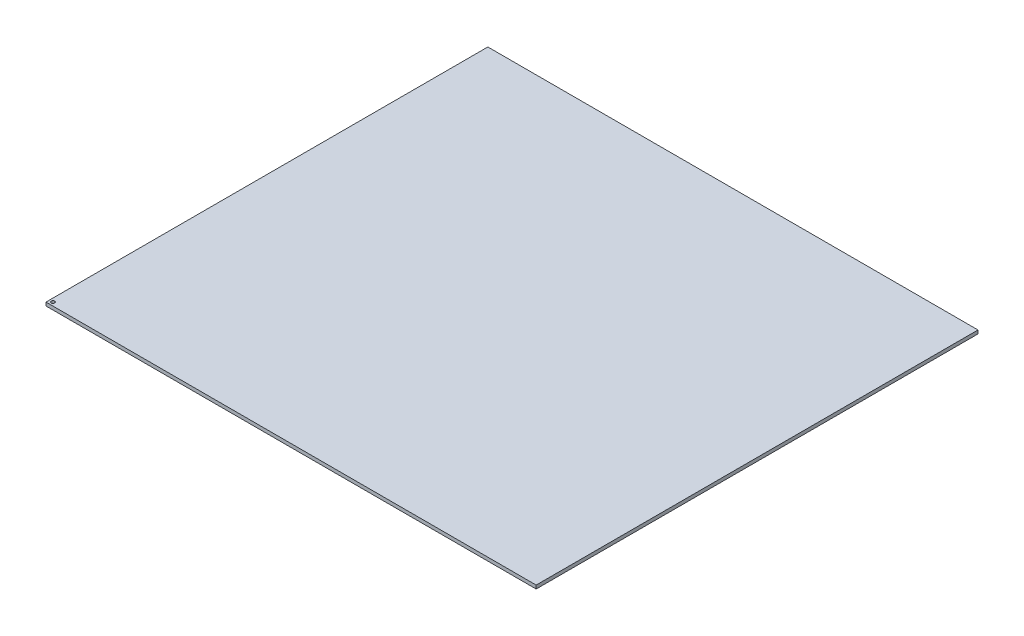
ISO-10303-21;
HEADER;
FILE_DESCRIPTION(('STEP AP214'),'2;1');
FILE_NAME('part.step','',(''),(''),'','','');
FILE_SCHEMA(('AUTOMOTIVE_DESIGN { 1 0 10303 214 1 1 1 1 }'));
ENDSEC;
DATA;
#1=APPLICATION_CONTEXT('core data for automotive mechanical design processes');
#2=APPLICATION_PROTOCOL_DEFINITION('international standard','automotive_design',2000,#1);
#3=PRODUCT_CONTEXT('',#1,'mechanical');
#4=PRODUCT('Part','Part','',(#3));
#5=PRODUCT_RELATED_PRODUCT_CATEGORY('part','',(#4));
#6=PRODUCT_DEFINITION_FORMATION('','',#4);
#7=PRODUCT_DEFINITION_CONTEXT('part definition',#1,'design');
#8=PRODUCT_DEFINITION('design','',#6,#7);
#9=PRODUCT_DEFINITION_SHAPE('','',#8);
#10=(LENGTH_UNIT() NAMED_UNIT(*) SI_UNIT(.MILLI.,.METRE.));
#11=(NAMED_UNIT(*) PLANE_ANGLE_UNIT() SI_UNIT($,.RADIAN.));
#12=(NAMED_UNIT(*) SI_UNIT($,.STERADIAN.) SOLID_ANGLE_UNIT());
#13=UNCERTAINTY_MEASURE_WITH_UNIT(LENGTH_MEASURE(1.E-05),#10,'distance_accuracy_value','');
#14=(GEOMETRIC_REPRESENTATION_CONTEXT(3) GLOBAL_UNCERTAINTY_ASSIGNED_CONTEXT((#13)) GLOBAL_UNIT_ASSIGNED_CONTEXT((#10,
#11,#12)) REPRESENTATION_CONTEXT('',''));
#15=CARTESIAN_POINT('',(0.,0.,0.));
#16=DIRECTION('',(0.,0.,1.));
#17=DIRECTION('',(1.,0.,0.));
#18=AXIS2_PLACEMENT_3D('',#15,#16,#17);
#19=CARTESIAN_POINT('',(450.85,3.175,406.4));
#20=DIRECTION('',(-1.,0.,0.));
#21=DIRECTION('',(0.,0.,1.));
#22=AXIS2_PLACEMENT_3D('',#19,#20,#21);
#23=PLANE('',#22);
#24=DIRECTION('',(0.,0.,-1.));
#25=VECTOR('',#24,1.);
#26=CARTESIAN_POINT('',(450.85,-3.175,406.4));
#27=LINE('',#26,#25);
#28=CARTESIAN_POINT('',(450.85,-3.175,406.4));
#29=VERTEX_POINT('',#28);
#30=CARTESIAN_POINT('',(450.85,-3.175,-406.4));
#31=VERTEX_POINT('',#30);
#32=EDGE_CURVE('E97',#29,#31,#27,.T.);
#33=ORIENTED_EDGE('',*,*,#32,.T.);
#34=DIRECTION('',(0.,-1.,0.));
#35=VECTOR('',#34,1.);
#36=CARTESIAN_POINT('',(450.85,3.175,-406.4));
#37=LINE('',#36,#35);
#38=CARTESIAN_POINT('',(450.85,3.175,-406.4));
#39=VERTEX_POINT('',#38);
#40=EDGE_CURVE('E11',#39,#31,#37,.T.);
#41=ORIENTED_EDGE('',*,*,#40,.F.);
#42=DIRECTION('',(0.,0.,-1.));
#43=VECTOR('',#42,1.);
#44=CARTESIAN_POINT('',(450.85,3.175,406.4));
#45=LINE('',#44,#43);
#46=CARTESIAN_POINT('',(450.85,3.175,406.4));
#47=VERTEX_POINT('',#46);
#48=EDGE_CURVE('E85',#47,#39,#45,.T.);
#49=ORIENTED_EDGE('',*,*,#48,.F.);
#50=DIRECTION('',(0.,-1.,0.));
#51=VECTOR('',#50,1.);
#52=CARTESIAN_POINT('',(450.85,3.175,406.4));
#53=LINE('',#52,#51);
#54=EDGE_CURVE('E93',#47,#29,#53,.T.);
#55=ORIENTED_EDGE('',*,*,#54,.T.);
#56=EDGE_LOOP('',(#33,#41,#49,#55));
#57=FACE_BOUND('',#56,.T.);
#58=ADVANCED_FACE('F34',(#57),#23,.F.);
#59=CARTESIAN_POINT('',(-450.85,3.175,-406.4));
#60=DIRECTION('',(0.,0.,1.));
#61=DIRECTION('',(1.,0.,0.));
#62=AXIS2_PLACEMENT_3D('',#59,#60,#61);
#63=PLANE('',#62);
#64=DIRECTION('',(-1.,0.,0.));
#65=VECTOR('',#64,1.);
#66=CARTESIAN_POINT('',(-450.85,-3.175,-406.4));
#67=LINE('',#66,#65);
#68=CARTESIAN_POINT('',(-450.85,-3.175,-406.4));
#69=VERTEX_POINT('',#68);
#70=EDGE_CURVE('E89',#31,#69,#67,.T.);
#71=ORIENTED_EDGE('',*,*,#70,.T.);
#72=DIRECTION('',(0.,-1.,0.));
#73=VECTOR('',#72,1.);
#74=CARTESIAN_POINT('',(-450.85,3.175,-406.4));
#75=LINE('',#74,#73);
#76=CARTESIAN_POINT('',(-450.85,3.175,-406.4));
#77=VERTEX_POINT('',#76);
#78=EDGE_CURVE('E42',#77,#69,#75,.T.);
#79=ORIENTED_EDGE('',*,*,#78,.F.);
#80=DIRECTION('',(-1.,0.,0.));
#81=VECTOR('',#80,1.);
#82=CARTESIAN_POINT('',(-450.85,3.175,-406.4));
#83=LINE('',#82,#81);
#84=EDGE_CURVE('E80',#39,#77,#83,.T.);
#85=ORIENTED_EDGE('',*,*,#84,.F.);
#86=ORIENTED_EDGE('',*,*,#40,.T.);
#87=EDGE_LOOP('',(#71,#79,#85,#86));
#88=FACE_BOUND('',#87,.T.);
#89=ADVANCED_FACE('F88',(#88),#63,.F.);
#90=CARTESIAN_POINT('',(-450.85,3.175,406.4));
#91=DIRECTION('',(1.,0.,0.));
#92=DIRECTION('',(0.,0.,-1.));
#93=AXIS2_PLACEMENT_3D('',#90,#91,#92);
#94=PLANE('',#93);
#95=DIRECTION('',(0.,0.,1.));
#96=VECTOR('',#95,1.);
#97=CARTESIAN_POINT('',(-450.85,-3.175,406.4));
#98=LINE('',#97,#96);
#99=CARTESIAN_POINT('',(-450.85,-3.175,406.4));
#100=VERTEX_POINT('',#99);
#101=EDGE_CURVE('E67',#69,#100,#98,.T.);
#102=ORIENTED_EDGE('',*,*,#101,.T.);
#103=DIRECTION('',(0.,-1.,0.));
#104=VECTOR('',#103,1.);
#105=CARTESIAN_POINT('',(-450.85,3.175,406.4));
#106=LINE('',#105,#104);
#107=CARTESIAN_POINT('',(-450.85,3.175,406.4));
#108=VERTEX_POINT('',#107);
#109=EDGE_CURVE('E90',#108,#100,#106,.T.);
#110=ORIENTED_EDGE('',*,*,#109,.F.);
#111=DIRECTION('',(0.,0.,1.));
#112=VECTOR('',#111,1.);
#113=CARTESIAN_POINT('',(-450.85,3.175,406.4));
#114=LINE('',#113,#112);
#115=EDGE_CURVE('E83',#77,#108,#114,.T.);
#116=ORIENTED_EDGE('',*,*,#115,.F.);
#117=ORIENTED_EDGE('',*,*,#78,.T.);
#118=EDGE_LOOP('',(#102,#110,#116,#117));
#119=FACE_BOUND('',#118,.T.);
#120=ADVANCED_FACE('F91',(#119),#94,.F.);
#121=CARTESIAN_POINT('',(-450.85,3.175,406.4));
#122=DIRECTION('',(0.,0.,-1.));
#123=DIRECTION('',(-1.,0.,0.));
#124=AXIS2_PLACEMENT_3D('',#121,#122,#123);
#125=PLANE('',#124);
#126=DIRECTION('',(1.,0.,0.));
#127=VECTOR('',#126,1.);
#128=CARTESIAN_POINT('',(-450.85,-3.175,406.4));
#129=LINE('',#128,#127);
#130=EDGE_CURVE('E73',#100,#29,#129,.T.);
#131=ORIENTED_EDGE('',*,*,#130,.T.);
#132=ORIENTED_EDGE('',*,*,#54,.F.);
#133=DIRECTION('',(1.,0.,0.));
#134=VECTOR('',#133,1.);
#135=CARTESIAN_POINT('',(-450.85,3.175,406.4));
#136=LINE('',#135,#134);
#137=EDGE_CURVE('E50',#108,#47,#136,.T.);
#138=ORIENTED_EDGE('',*,*,#137,.F.);
#139=ORIENTED_EDGE('',*,*,#109,.T.);
#140=EDGE_LOOP('',(#131,#132,#138,#139));
#141=FACE_BOUND('',#140,.T.);
#142=ADVANCED_FACE('F105',(#141),#125,.F.);
#143=CARTESIAN_POINT('',(0.,3.175,0.));
#144=DIRECTION('',(0.,-1.,0.));
#145=DIRECTION('',(0.,0.,-1.));
#146=AXIS2_PLACEMENT_3D('',#143,#144,#145);
#147=PLANE('',#146);
#148=CARTESIAN_POINT('',(-444.5,3.175,400.05));
#149=DIRECTION('',(0.,1.,0.));
#150=DIRECTION('',(0.,0.,1.));
#151=AXIS2_PLACEMENT_3D('',#148,#149,#150);
#152=CIRCLE('',#151,3.17499999999997);
#153=CARTESIAN_POINT('',(-444.5,3.175,403.225));
#154=VERTEX_POINT('',#153);
#155=EDGE_CURVE('E111',#154,#154,#152,.T.);
#156=ORIENTED_EDGE('',*,*,#155,.F.);
#157=EDGE_LOOP('',(#156));
#158=FACE_BOUND('',#157,.T.);
#159=ORIENTED_EDGE('',*,*,#48,.T.);
#160=ORIENTED_EDGE('',*,*,#84,.T.);
#161=ORIENTED_EDGE('',*,*,#115,.T.);
#162=ORIENTED_EDGE('',*,*,#137,.T.);
#163=EDGE_LOOP('',(#159,#160,#161,#162));
#164=FACE_BOUND('',#163,.T.);
#165=ADVANCED_FACE('F81',(#158,#164),#147,.F.);
#166=CARTESIAN_POINT('',(0.,-3.175,0.));
#167=DIRECTION('',(0.,-1.,0.));
#168=DIRECTION('',(0.,0.,-1.));
#169=AXIS2_PLACEMENT_3D('',#166,#167,#168);
#170=PLANE('',#169);
#171=CARTESIAN_POINT('',(-444.5,-3.175,400.05));
#172=DIRECTION('',(0.,1.,0.));
#173=DIRECTION('',(0.,0.,1.));
#174=AXIS2_PLACEMENT_3D('',#171,#172,#173);
#175=CIRCLE('',#174,3.17499999999997);
#176=CARTESIAN_POINT('',(-444.5,-3.175,403.225));
#177=VERTEX_POINT('',#176);
#178=EDGE_CURVE('E100',#177,#177,#175,.T.);
#179=ORIENTED_EDGE('',*,*,#178,.T.);
#180=EDGE_LOOP('',(#179));
#181=FACE_BOUND('',#180,.T.);
#182=ORIENTED_EDGE('',*,*,#32,.F.);
#183=ORIENTED_EDGE('',*,*,#130,.F.);
#184=ORIENTED_EDGE('',*,*,#101,.F.);
#185=ORIENTED_EDGE('',*,*,#70,.F.);
#186=EDGE_LOOP('',(#182,#183,#184,#185));
#187=FACE_BOUND('',#186,.T.);
#188=ADVANCED_FACE('F108',(#181,#187),#170,.T.);
#189=CARTESIAN_POINT('',(-444.5,-3.175,400.05));
#190=DIRECTION('',(0.,1.,0.));
#191=DIRECTION('',(0.,0.,1.));
#192=AXIS2_PLACEMENT_3D('',#189,#190,#191);
#193=CYLINDRICAL_SURFACE('',#192,3.17499999999997);
#194=ORIENTED_EDGE('',*,*,#178,.F.);
#195=EDGE_LOOP('',(#194));
#196=FACE_BOUND('',#195,.T.);
#197=ORIENTED_EDGE('',*,*,#155,.T.);
#198=EDGE_LOOP('',(#197));
#199=FACE_BOUND('',#198,.T.);
#200=ADVANCED_FACE('F118',(#196,#199),#193,.F.);
#201=CLOSED_SHELL('',(#58,#89,#120,#142,#165,#188,#200));
#202=MANIFOLD_SOLID_BREP('B2',#201);
#203=ADVANCED_BREP_SHAPE_REPRESENTATION('',(#18,#202),#14);
#204=SHAPE_DEFINITION_REPRESENTATION(#9,#203);
ENDSEC;
END-ISO-10303-21;
